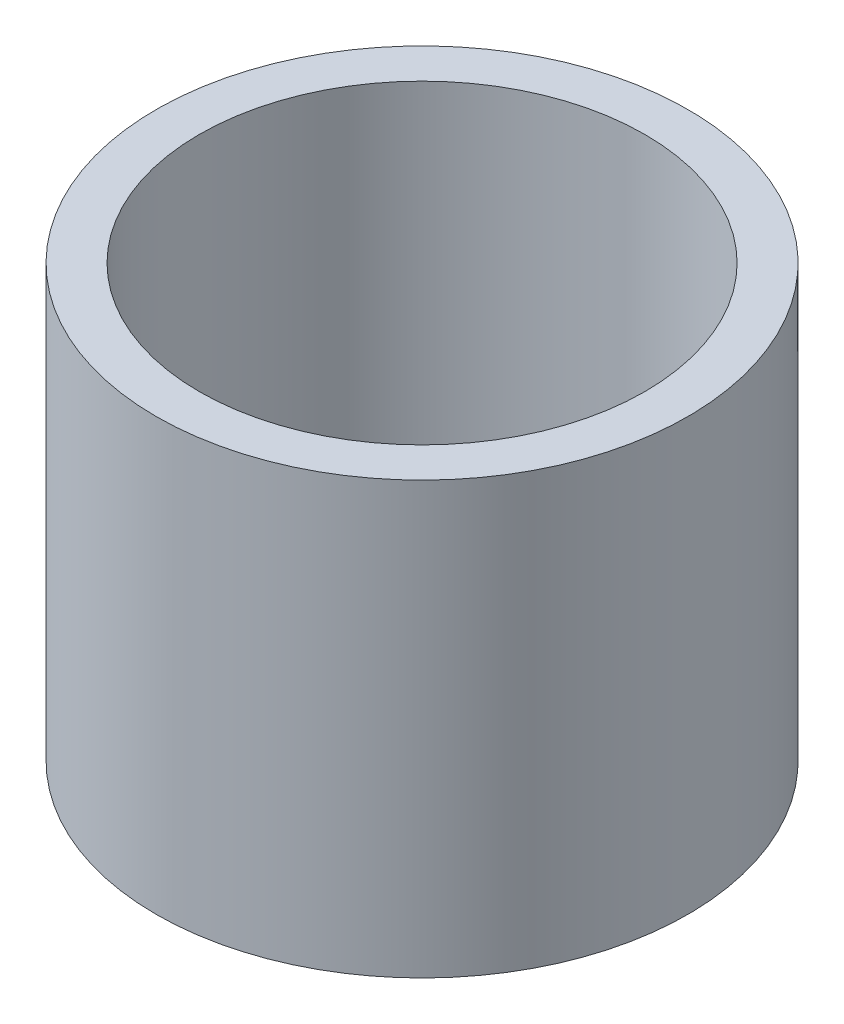
ISO-10303-21;
HEADER;
FILE_DESCRIPTION(('STEP AP214'),'2;1');
FILE_NAME('part.step','',(''),(''),'','','');
FILE_SCHEMA(('AUTOMOTIVE_DESIGN { 1 0 10303 214 1 1 1 1 }'));
ENDSEC;
DATA;
#1=APPLICATION_CONTEXT('core data for automotive mechanical design processes');
#2=APPLICATION_PROTOCOL_DEFINITION('international standard','automotive_design',2000,#1);
#3=PRODUCT_CONTEXT('',#1,'mechanical');
#4=PRODUCT('Part','Part','',(#3));
#5=PRODUCT_RELATED_PRODUCT_CATEGORY('part','',(#4));
#6=PRODUCT_DEFINITION_FORMATION('','',#4);
#7=PRODUCT_DEFINITION_CONTEXT('part definition',#1,'design');
#8=PRODUCT_DEFINITION('design','',#6,#7);
#9=PRODUCT_DEFINITION_SHAPE('','',#8);
#10=(LENGTH_UNIT() NAMED_UNIT(*) SI_UNIT(.MILLI.,.METRE.));
#11=(NAMED_UNIT(*) PLANE_ANGLE_UNIT() SI_UNIT($,.RADIAN.));
#12=(NAMED_UNIT(*) SI_UNIT($,.STERADIAN.) SOLID_ANGLE_UNIT());
#13=UNCERTAINTY_MEASURE_WITH_UNIT(LENGTH_MEASURE(1.E-05),#10,'distance_accuracy_value','');
#14=(GEOMETRIC_REPRESENTATION_CONTEXT(3) GLOBAL_UNCERTAINTY_ASSIGNED_CONTEXT((#13)) GLOBAL_UNIT_ASSIGNED_CONTEXT((#10,
#11,#12)) REPRESENTATION_CONTEXT('',''));
#15=CARTESIAN_POINT('',(0.,0.,0.));
#16=DIRECTION('',(0.,0.,1.));
#17=DIRECTION('',(1.,0.,0.));
#18=AXIS2_PLACEMENT_3D('',#15,#16,#17);
#19=CARTESIAN_POINT('',(0.,30.,0.));
#20=DIRECTION('',(0.,-1.,0.));
#21=DIRECTION('',(0.,0.,-1.));
#22=AXIS2_PLACEMENT_3D('',#19,#20,#21);
#23=CYLINDRICAL_SURFACE('',#22,15.5);
#24=CARTESIAN_POINT('',(0.,30.,0.));
#25=DIRECTION('',(0.,1.,0.));
#26=DIRECTION('',(0.,0.,1.));
#27=AXIS2_PLACEMENT_3D('',#24,#25,#26);
#28=CIRCLE('',#27,15.5);
#29=CARTESIAN_POINT('',(0.,30.,15.5));
#30=VERTEX_POINT('',#29);
#31=EDGE_CURVE('E42',#30,#30,#28,.T.);
#32=ORIENTED_EDGE('',*,*,#31,.T.);
#33=EDGE_LOOP('',(#32));
#34=FACE_BOUND('',#33,.T.);
#35=CARTESIAN_POINT('',(0.,0.,0.));
#36=DIRECTION('',(0.,1.,0.));
#37=DIRECTION('',(0.,0.,1.));
#38=AXIS2_PLACEMENT_3D('',#35,#36,#37);
#39=CIRCLE('',#38,15.5);
#40=CARTESIAN_POINT('',(0.,0.,15.5));
#41=VERTEX_POINT('',#40);
#42=EDGE_CURVE('E48',#41,#41,#39,.T.);
#43=ORIENTED_EDGE('',*,*,#42,.F.);
#44=EDGE_LOOP('',(#43));
#45=FACE_BOUND('',#44,.T.);
#46=ADVANCED_FACE('F35',(#34,#45),#23,.F.);
#47=CARTESIAN_POINT('',(0.,30.,0.));
#48=DIRECTION('',(0.,-1.,0.));
#49=DIRECTION('',(0.,0.,-1.));
#50=AXIS2_PLACEMENT_3D('',#47,#48,#49);
#51=CYLINDRICAL_SURFACE('',#50,18.5);
#52=CARTESIAN_POINT('',(0.,30.,0.));
#53=DIRECTION('',(0.,1.,0.));
#54=DIRECTION('',(0.,0.,1.));
#55=AXIS2_PLACEMENT_3D('',#52,#53,#54);
#56=CIRCLE('',#55,18.5);
#57=CARTESIAN_POINT('',(0.,30.,18.5));
#58=VERTEX_POINT('',#57);
#59=EDGE_CURVE('E10',#58,#58,#56,.T.);
#60=ORIENTED_EDGE('',*,*,#59,.F.);
#61=EDGE_LOOP('',(#60));
#62=FACE_BOUND('',#61,.T.);
#63=CARTESIAN_POINT('',(0.,0.,0.));
#64=DIRECTION('',(0.,1.,0.));
#65=DIRECTION('',(0.,0.,1.));
#66=AXIS2_PLACEMENT_3D('',#63,#64,#65);
#67=CIRCLE('',#66,18.5);
#68=CARTESIAN_POINT('',(0.,0.,18.5));
#69=VERTEX_POINT('',#68);
#70=EDGE_CURVE('E38',#69,#69,#67,.T.);
#71=ORIENTED_EDGE('',*,*,#70,.T.);
#72=EDGE_LOOP('',(#71));
#73=FACE_BOUND('',#72,.T.);
#74=ADVANCED_FACE('F55',(#62,#73),#51,.T.);
#75=CARTESIAN_POINT('',(0.,30.,0.));
#76=DIRECTION('',(0.,1.,0.));
#77=DIRECTION('',(0.,0.,1.));
#78=AXIS2_PLACEMENT_3D('',#75,#76,#77);
#79=PLANE('',#78);
#80=ORIENTED_EDGE('',*,*,#31,.F.);
#81=EDGE_LOOP('',(#80));
#82=FACE_BOUND('',#81,.T.);
#83=ORIENTED_EDGE('',*,*,#59,.T.);
#84=EDGE_LOOP('',(#83));
#85=FACE_BOUND('',#84,.T.);
#86=ADVANCED_FACE('F59',(#82,#85),#79,.T.);
#87=CARTESIAN_POINT('',(0.,0.,0.));
#88=DIRECTION('',(0.,1.,0.));
#89=DIRECTION('',(0.,0.,1.));
#90=AXIS2_PLACEMENT_3D('',#87,#88,#89);
#91=PLANE('',#90);
#92=ORIENTED_EDGE('',*,*,#42,.T.);
#93=EDGE_LOOP('',(#92));
#94=FACE_BOUND('',#93,.T.);
#95=ORIENTED_EDGE('',*,*,#70,.F.);
#96=EDGE_LOOP('',(#95));
#97=FACE_BOUND('',#96,.T.);
#98=ADVANCED_FACE('F57',(#94,#97),#91,.F.);
#99=CLOSED_SHELL('',(#46,#74,#86,#98));
#100=MANIFOLD_SOLID_BREP('B2',#99);
#101=ADVANCED_BREP_SHAPE_REPRESENTATION('',(#18,#100),#14);
#102=SHAPE_DEFINITION_REPRESENTATION(#9,#101);
ENDSEC;
END-ISO-10303-21;
